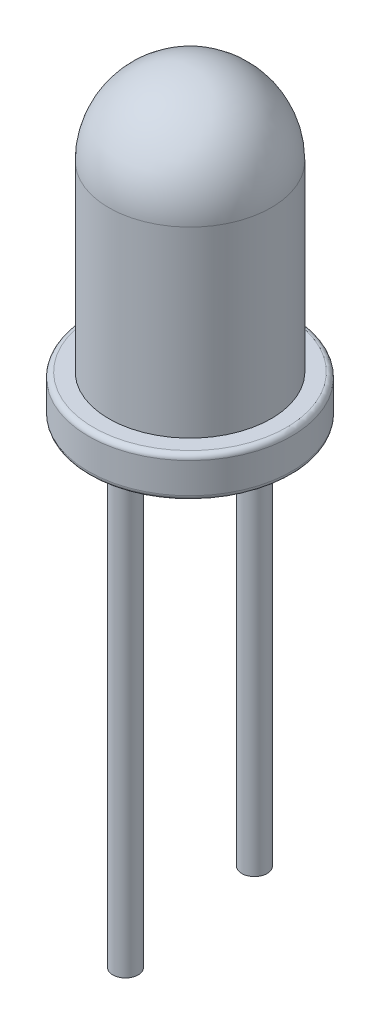
ISO-10303-21;
HEADER;
FILE_DESCRIPTION(('STEP AP214'),'2;1');
FILE_NAME('part.step','',(''),(''),'','','');
FILE_SCHEMA(('AUTOMOTIVE_DESIGN { 1 0 10303 214 1 1 1 1 }'));
ENDSEC;
DATA;
#1=APPLICATION_CONTEXT('core data for automotive mechanical design processes');
#2=APPLICATION_PROTOCOL_DEFINITION('international standard','automotive_design',2000,#1);
#3=PRODUCT_CONTEXT('',#1,'mechanical');
#4=PRODUCT('Part','Part','',(#3));
#5=PRODUCT_RELATED_PRODUCT_CATEGORY('part','',(#4));
#6=PRODUCT_DEFINITION_FORMATION('','',#4);
#7=PRODUCT_DEFINITION_CONTEXT('part definition',#1,'design');
#8=PRODUCT_DEFINITION('design','',#6,#7);
#9=PRODUCT_DEFINITION_SHAPE('','',#8);
#10=(LENGTH_UNIT() NAMED_UNIT(*) SI_UNIT(.MILLI.,.METRE.));
#11=(NAMED_UNIT(*) PLANE_ANGLE_UNIT() SI_UNIT($,.RADIAN.));
#12=(NAMED_UNIT(*) SI_UNIT($,.STERADIAN.) SOLID_ANGLE_UNIT());
#13=UNCERTAINTY_MEASURE_WITH_UNIT(LENGTH_MEASURE(1.E-05),#10,'distance_accuracy_value','');
#14=(GEOMETRIC_REPRESENTATION_CONTEXT(3) GLOBAL_UNCERTAINTY_ASSIGNED_CONTEXT((#13)) GLOBAL_UNIT_ASSIGNED_CONTEXT((#10,
#11,#12)) REPRESENTATION_CONTEXT('',''));
#15=CARTESIAN_POINT('',(0.,0.,0.));
#16=DIRECTION('',(0.,0.,1.));
#17=DIRECTION('',(1.,0.,0.));
#18=AXIS2_PLACEMENT_3D('',#15,#16,#17);
#19=CARTESIAN_POINT('',(0.,4.4,0.));
#20=DIRECTION('',(0.,1.,0.));
#21=DIRECTION('',(-1.,0.,0.));
#22=AXIS2_PLACEMENT_3D('',#19,#20,#21);
#23=SPHERICAL_SURFACE('',#22,1.6);
#24=CARTESIAN_POINT('',(0.,4.4,0.));
#25=DIRECTION('',(0.,1.,0.));
#26=DIRECTION('',(0.,0.,1.));
#27=AXIS2_PLACEMENT_3D('',#24,#25,#26);
#28=CIRCLE('',#27,1.6);
#29=CARTESIAN_POINT('',(0.,4.4,1.6));
#30=VERTEX_POINT('',#29);
#31=EDGE_CURVE('E62',#30,#30,#28,.T.);
#32=ORIENTED_EDGE('',*,*,#31,.T.);
#33=EDGE_LOOP('',(#32));
#34=FACE_BOUND('',#33,.T.);
#35=ADVANCED_FACE('F36',(#34),#23,.T.);
#36=CARTESIAN_POINT('',(0.,8.59832072129685,0.));
#37=DIRECTION('',(0.,1.,0.));
#38=DIRECTION('',(0.,0.,1.));
#39=AXIS2_PLACEMENT_3D('',#36,#37,#38);
#40=CYLINDRICAL_SURFACE('',#39,1.6);
#41=ORIENTED_EDGE('',*,*,#31,.F.);
#42=EDGE_LOOP('',(#41));
#43=FACE_BOUND('',#42,.T.);
#44=CARTESIAN_POINT('',(0.,0.799999999999999,0.));
#45=DIRECTION('',(0.,1.,0.));
#46=DIRECTION('',(0.,0.,1.));
#47=AXIS2_PLACEMENT_3D('',#44,#45,#46);
#48=CIRCLE('',#47,1.6);
#49=CARTESIAN_POINT('',(0.,0.799999999999999,1.6));
#50=VERTEX_POINT('',#49);
#51=EDGE_CURVE('E65',#50,#50,#48,.T.);
#52=ORIENTED_EDGE('',*,*,#51,.T.);
#53=EDGE_LOOP('',(#52));
#54=FACE_BOUND('',#53,.T.);
#55=ADVANCED_FACE('F90',(#43,#54),#40,.T.);
#56=CARTESIAN_POINT('',(0.,0.8,0.));
#57=DIRECTION('',(0.,-1.,0.));
#58=DIRECTION('',(0.,0.,-1.));
#59=AXIS2_PLACEMENT_3D('',#56,#57,#58);
#60=PLANE('',#59);
#61=CARTESIAN_POINT('',(0.,0.8,0.));
#62=DIRECTION('',(0.,-1.,0.));
#63=DIRECTION('',(0.,0.,-1.));
#64=AXIS2_PLACEMENT_3D('',#61,#62,#63);
#65=CIRCLE('',#64,1.9);
#66=CARTESIAN_POINT('',(0.,0.8,-1.9));
#67=VERTEX_POINT('',#66);
#68=EDGE_CURVE('E47',#67,#67,#65,.F.);
#69=ORIENTED_EDGE('',*,*,#68,.T.);
#70=EDGE_LOOP('',(#69));
#71=FACE_BOUND('',#70,.T.);
#72=ORIENTED_EDGE('',*,*,#51,.F.);
#73=EDGE_LOOP('',(#72));
#74=FACE_BOUND('',#73,.T.);
#75=ADVANCED_FACE('F96',(#71,#74),#60,.F.);
#76=CARTESIAN_POINT('',(0.,8.59832072129685,0.));
#77=DIRECTION('',(0.,1.,0.));
#78=DIRECTION('',(0.,0.,1.));
#79=AXIS2_PLACEMENT_3D('',#76,#77,#78);
#80=CYLINDRICAL_SURFACE('',#79,2.);
#81=CARTESIAN_POINT('',(0.,0.0999999999999994,0.));
#82=DIRECTION('',(0.,1.,0.));
#83=DIRECTION('',(0.,0.,1.));
#84=AXIS2_PLACEMENT_3D('',#81,#82,#83);
#85=CIRCLE('',#84,2.);
#86=CARTESIAN_POINT('',(0.,0.0999999999999994,2.));
#87=VERTEX_POINT('',#86);
#88=EDGE_CURVE('E56',#87,#87,#85,.T.);
#89=ORIENTED_EDGE('',*,*,#88,.T.);
#90=EDGE_LOOP('',(#89));
#91=FACE_BOUND('',#90,.T.);
#92=CARTESIAN_POINT('',(0.,0.699999999999999,0.));
#93=DIRECTION('',(0.,-1.,0.));
#94=DIRECTION('',(0.,0.,-1.));
#95=AXIS2_PLACEMENT_3D('',#92,#93,#94);
#96=CIRCLE('',#95,2.);
#97=CARTESIAN_POINT('',(0.,0.699999999999999,-2.));
#98=VERTEX_POINT('',#97);
#99=EDGE_CURVE('E59',#98,#98,#96,.T.);
#100=ORIENTED_EDGE('',*,*,#99,.T.);
#101=EDGE_LOOP('',(#100));
#102=FACE_BOUND('',#101,.T.);
#103=ADVANCED_FACE('F109',(#91,#102),#80,.T.);
#104=CARTESIAN_POINT('',(0.,0.,0.));
#105=DIRECTION('',(0.,1.,0.));
#106=DIRECTION('',(0.,0.,1.));
#107=AXIS2_PLACEMENT_3D('',#104,#105,#106);
#108=PLANE('',#107);
#109=CARTESIAN_POINT('',(1.27,0.,0.));
#110=DIRECTION('',(0.,1.,0.));
#111=DIRECTION('',(0.,0.,1.));
#112=AXIS2_PLACEMENT_3D('',#109,#110,#111);
#113=CIRCLE('',#112,0.25);
#114=CARTESIAN_POINT('',(1.27,0.,0.25));
#115=VERTEX_POINT('',#114);
#116=EDGE_CURVE('E10',#115,#115,#113,.F.);
#117=ORIENTED_EDGE('',*,*,#116,.F.);
#118=EDGE_LOOP('',(#117));
#119=FACE_BOUND('',#118,.T.);
#120=CARTESIAN_POINT('',(-1.27,0.,0.));
#121=DIRECTION('',(0.,1.,0.));
#122=DIRECTION('',(0.,0.,1.));
#123=AXIS2_PLACEMENT_3D('',#120,#121,#122);
#124=CIRCLE('',#123,0.25);
#125=CARTESIAN_POINT('',(-1.27,0.,0.25));
#126=VERTEX_POINT('',#125);
#127=EDGE_CURVE('E43',#126,#126,#124,.F.);
#128=ORIENTED_EDGE('',*,*,#127,.F.);
#129=EDGE_LOOP('',(#128));
#130=FACE_BOUND('',#129,.T.);
#131=CARTESIAN_POINT('',(0.,0.,0.));
#132=DIRECTION('',(0.,1.,0.));
#133=DIRECTION('',(0.,0.,1.));
#134=AXIS2_PLACEMENT_3D('',#131,#132,#133);
#135=CIRCLE('',#134,1.9);
#136=CARTESIAN_POINT('',(0.,0.,1.9));
#137=VERTEX_POINT('',#136);
#138=EDGE_CURVE('E51',#137,#137,#135,.F.);
#139=ORIENTED_EDGE('',*,*,#138,.T.);
#140=EDGE_LOOP('',(#139));
#141=FACE_BOUND('',#140,.T.);
#142=ADVANCED_FACE('F102',(#119,#130,#141),#108,.F.);
#143=CARTESIAN_POINT('',(0.,0.0999999999999994,0.));
#144=DIRECTION('',(0.,1.,0.));
#145=DIRECTION('',(0.,0.,1.));
#146=AXIS2_PLACEMENT_3D('',#143,#144,#145);
#147=TOROIDAL_SURFACE('',#146,1.9,0.1);
#148=ORIENTED_EDGE('',*,*,#138,.F.);
#149=EDGE_LOOP('',(#148));
#150=FACE_BOUND('',#149,.T.);
#151=ORIENTED_EDGE('',*,*,#88,.F.);
#152=EDGE_LOOP('',(#151));
#153=FACE_BOUND('',#152,.T.);
#154=ADVANCED_FACE('F100',(#150,#153),#147,.T.);
#155=CARTESIAN_POINT('',(0.,0.699999999999999,0.));
#156=DIRECTION('',(0.,-1.,0.));
#157=DIRECTION('',(0.,0.,-1.));
#158=AXIS2_PLACEMENT_3D('',#155,#156,#157);
#159=TOROIDAL_SURFACE('',#158,1.9,0.1);
#160=ORIENTED_EDGE('',*,*,#99,.F.);
#161=EDGE_LOOP('',(#160));
#162=FACE_BOUND('',#161,.T.);
#163=ORIENTED_EDGE('',*,*,#68,.F.);
#164=EDGE_LOOP('',(#163));
#165=FACE_BOUND('',#164,.T.);
#166=ADVANCED_FACE('F38',(#162,#165),#159,.T.);
#167=CARTESIAN_POINT('',(-1.27,-10.,0.));
#168=DIRECTION('',(0.,1.,0.));
#169=DIRECTION('',(0.,0.,1.));
#170=AXIS2_PLACEMENT_3D('',#167,#168,#169);
#171=CYLINDRICAL_SURFACE('',#170,0.25);
#172=CARTESIAN_POINT('',(-1.27,-10.,0.));
#173=DIRECTION('',(0.,-1.,0.));
#174=DIRECTION('',(0.,0.,-1.));
#175=AXIS2_PLACEMENT_3D('',#172,#173,#174);
#176=CIRCLE('',#175,0.25);
#177=CARTESIAN_POINT('',(-1.27,-10.,-0.25));
#178=VERTEX_POINT('',#177);
#179=EDGE_CURVE('E68',#178,#178,#176,.T.);
#180=ORIENTED_EDGE('',*,*,#179,.F.);
#181=EDGE_LOOP('',(#180));
#182=FACE_BOUND('',#181,.T.);
#183=ORIENTED_EDGE('',*,*,#127,.T.);
#184=EDGE_LOOP('',(#183));
#185=FACE_BOUND('',#184,.T.);
#186=ADVANCED_FACE('F86',(#182,#185),#171,.T.);
#187=CARTESIAN_POINT('',(-1.27,-10.,0.));
#188=DIRECTION('',(0.,-1.,0.));
#189=DIRECTION('',(0.,0.,-1.));
#190=AXIS2_PLACEMENT_3D('',#187,#188,#189);
#191=PLANE('',#190);
#192=ORIENTED_EDGE('',*,*,#179,.T.);
#193=EDGE_LOOP('',(#192));
#194=FACE_BOUND('',#193,.T.);
#195=ADVANCED_FACE('F79',(#194),#191,.T.);
#196=CARTESIAN_POINT('',(1.27,-7.,0.));
#197=DIRECTION('',(0.,1.,0.));
#198=DIRECTION('',(0.,0.,1.));
#199=AXIS2_PLACEMENT_3D('',#196,#197,#198);
#200=CYLINDRICAL_SURFACE('',#199,0.25);
#201=CARTESIAN_POINT('',(1.27,-7.,0.));
#202=DIRECTION('',(0.,-1.,0.));
#203=DIRECTION('',(0.,0.,-1.));
#204=AXIS2_PLACEMENT_3D('',#201,#202,#203);
#205=CIRCLE('',#204,0.25);
#206=CARTESIAN_POINT('',(1.27,-7.,-0.25));
#207=VERTEX_POINT('',#206);
#208=EDGE_CURVE('E71',#207,#207,#205,.T.);
#209=ORIENTED_EDGE('',*,*,#208,.F.);
#210=EDGE_LOOP('',(#209));
#211=FACE_BOUND('',#210,.T.);
#212=ORIENTED_EDGE('',*,*,#116,.T.);
#213=EDGE_LOOP('',(#212));
#214=FACE_BOUND('',#213,.T.);
#215=ADVANCED_FACE('F77',(#211,#214),#200,.T.);
#216=CARTESIAN_POINT('',(1.27,-7.,0.));
#217=DIRECTION('',(0.,-1.,0.));
#218=DIRECTION('',(0.,0.,-1.));
#219=AXIS2_PLACEMENT_3D('',#216,#217,#218);
#220=PLANE('',#219);
#221=ORIENTED_EDGE('',*,*,#208,.T.);
#222=EDGE_LOOP('',(#221));
#223=FACE_BOUND('',#222,.T.);
#224=ADVANCED_FACE('F75',(#223),#220,.T.);
#225=CLOSED_SHELL('',(#35,#55,#75,#103,#142,#154,#166,#186,#195,#215,#224));
#226=MANIFOLD_SOLID_BREP('B2',#225);
#227=ADVANCED_BREP_SHAPE_REPRESENTATION('',(#18,#226),#14);
#228=SHAPE_DEFINITION_REPRESENTATION(#9,#227);
ENDSEC;
END-ISO-10303-21;
